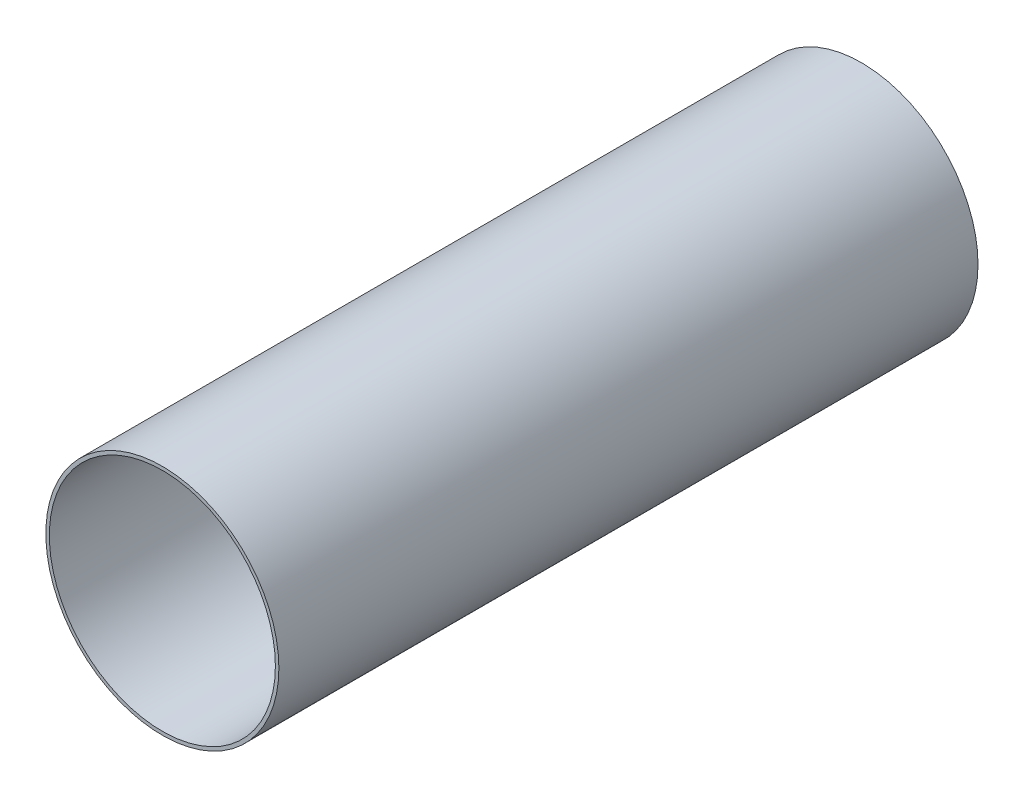
ISO-10303-21;
HEADER;
FILE_DESCRIPTION(('STEP AP214'),'2;1');
FILE_NAME('part.step','',(''),(''),'','','');
FILE_SCHEMA(('AUTOMOTIVE_DESIGN { 1 0 10303 214 1 1 1 1 }'));
ENDSEC;
DATA;
#1=APPLICATION_CONTEXT('core data for automotive mechanical design processes');
#2=APPLICATION_PROTOCOL_DEFINITION('international standard','automotive_design',2000,#1);
#3=PRODUCT_CONTEXT('',#1,'mechanical');
#4=PRODUCT('Part','Part','',(#3));
#5=PRODUCT_RELATED_PRODUCT_CATEGORY('part','',(#4));
#6=PRODUCT_DEFINITION_FORMATION('','',#4);
#7=PRODUCT_DEFINITION_CONTEXT('part definition',#1,'design');
#8=PRODUCT_DEFINITION('design','',#6,#7);
#9=PRODUCT_DEFINITION_SHAPE('','',#8);
#10=(LENGTH_UNIT() NAMED_UNIT(*) SI_UNIT(.MILLI.,.METRE.));
#11=(NAMED_UNIT(*) PLANE_ANGLE_UNIT() SI_UNIT($,.RADIAN.));
#12=(NAMED_UNIT(*) SI_UNIT($,.STERADIAN.) SOLID_ANGLE_UNIT());
#13=UNCERTAINTY_MEASURE_WITH_UNIT(LENGTH_MEASURE(1.E-05),#10,'distance_accuracy_value','');
#14=(GEOMETRIC_REPRESENTATION_CONTEXT(3) GLOBAL_UNCERTAINTY_ASSIGNED_CONTEXT((#13)) GLOBAL_UNIT_ASSIGNED_CONTEXT((#10,
#11,#12)) REPRESENTATION_CONTEXT('',''));
#15=CARTESIAN_POINT('',(0.,0.,0.));
#16=DIRECTION('',(0.,0.,1.));
#17=DIRECTION('',(1.,0.,0.));
#18=AXIS2_PLACEMENT_3D('',#15,#16,#17);
#19=CARTESIAN_POINT('',(0.,0.,300.));
#20=DIRECTION('',(0.,0.,-1.));
#21=DIRECTION('',(-1.,0.,0.));
#22=AXIS2_PLACEMENT_3D('',#19,#20,#21);
#23=CYLINDRICAL_SURFACE('',#22,50.);
#24=CARTESIAN_POINT('',(0.,0.,300.));
#25=DIRECTION('',(0.,0.,1.));
#26=DIRECTION('',(1.,0.,0.));
#27=AXIS2_PLACEMENT_3D('',#24,#25,#26);
#28=CIRCLE('',#27,50.);
#29=CARTESIAN_POINT('',(50.0000000000002,0.,300.));
#30=VERTEX_POINT('',#29);
#31=EDGE_CURVE('E12',#30,#30,#28,.T.);
#32=ORIENTED_EDGE('',*,*,#31,.F.);
#33=EDGE_LOOP('',(#32));
#34=FACE_BOUND('',#33,.T.);
#35=CARTESIAN_POINT('',(0.,0.,0.));
#36=DIRECTION('',(0.,0.,1.));
#37=DIRECTION('',(1.,0.,0.));
#38=AXIS2_PLACEMENT_3D('',#35,#36,#37);
#39=CIRCLE('',#38,50.);
#40=CARTESIAN_POINT('',(50.0000000000002,0.,0.));
#41=VERTEX_POINT('',#40);
#42=EDGE_CURVE('E49',#41,#41,#39,.T.);
#43=ORIENTED_EDGE('',*,*,#42,.T.);
#44=EDGE_LOOP('',(#43));
#45=FACE_BOUND('',#44,.T.);
#46=ADVANCED_FACE('F46',(#34,#45),#23,.T.);
#47=CARTESIAN_POINT('',(0.,0.,300.));
#48=DIRECTION('',(0.,0.,1.));
#49=DIRECTION('',(1.,0.,0.));
#50=AXIS2_PLACEMENT_3D('',#47,#48,#49);
#51=PLANE('',#50);
#52=CARTESIAN_POINT('',(0.,0.,300.));
#53=DIRECTION('',(0.,0.,1.));
#54=DIRECTION('',(1.,0.,0.));
#55=AXIS2_PLACEMENT_3D('',#52,#53,#54);
#56=CIRCLE('',#55,48.5);
#57=CARTESIAN_POINT('',(48.5000000000002,0.,300.));
#58=VERTEX_POINT('',#57);
#59=EDGE_CURVE('E56',#58,#58,#56,.T.);
#60=ORIENTED_EDGE('',*,*,#59,.F.);
#61=EDGE_LOOP('',(#60));
#62=FACE_BOUND('',#61,.T.);
#63=ORIENTED_EDGE('',*,*,#31,.T.);
#64=EDGE_LOOP('',(#63));
#65=FACE_BOUND('',#64,.T.);
#66=ADVANCED_FACE('F67',(#62,#65),#51,.T.);
#67=CARTESIAN_POINT('',(0.,0.,0.));
#68=DIRECTION('',(0.,0.,1.));
#69=DIRECTION('',(1.,0.,0.));
#70=AXIS2_PLACEMENT_3D('',#67,#68,#69);
#71=PLANE('',#70);
#72=CARTESIAN_POINT('',(0.,0.,0.));
#73=DIRECTION('',(0.,0.,1.));
#74=DIRECTION('',(1.,0.,0.));
#75=AXIS2_PLACEMENT_3D('',#72,#73,#74);
#76=CIRCLE('',#75,48.5);
#77=CARTESIAN_POINT('',(48.5000000000002,0.,0.));
#78=VERTEX_POINT('',#77);
#79=EDGE_CURVE('E58',#78,#78,#76,.T.);
#80=ORIENTED_EDGE('',*,*,#79,.T.);
#81=EDGE_LOOP('',(#80));
#82=FACE_BOUND('',#81,.T.);
#83=ORIENTED_EDGE('',*,*,#42,.F.);
#84=EDGE_LOOP('',(#83));
#85=FACE_BOUND('',#84,.T.);
#86=ADVANCED_FACE('F69',(#82,#85),#71,.F.);
#87=CARTESIAN_POINT('',(0.,0.,300.));
#88=DIRECTION('',(0.,0.,-1.));
#89=DIRECTION('',(-1.,0.,0.));
#90=AXIS2_PLACEMENT_3D('',#87,#88,#89);
#91=CYLINDRICAL_SURFACE('',#90,48.5);
#92=ORIENTED_EDGE('',*,*,#59,.T.);
#93=EDGE_LOOP('',(#92));
#94=FACE_BOUND('',#93,.T.);
#95=ORIENTED_EDGE('',*,*,#79,.F.);
#96=EDGE_LOOP('',(#95));
#97=FACE_BOUND('',#96,.T.);
#98=ADVANCED_FACE('F64',(#94,#97),#91,.F.);
#99=CLOSED_SHELL('',(#46,#66,#86,#98));
#100=MANIFOLD_SOLID_BREP('B2',#99);
#101=ADVANCED_BREP_SHAPE_REPRESENTATION('',(#18,#100),#14);
#102=SHAPE_DEFINITION_REPRESENTATION(#9,#101);
ENDSEC;
END-ISO-10303-21;
